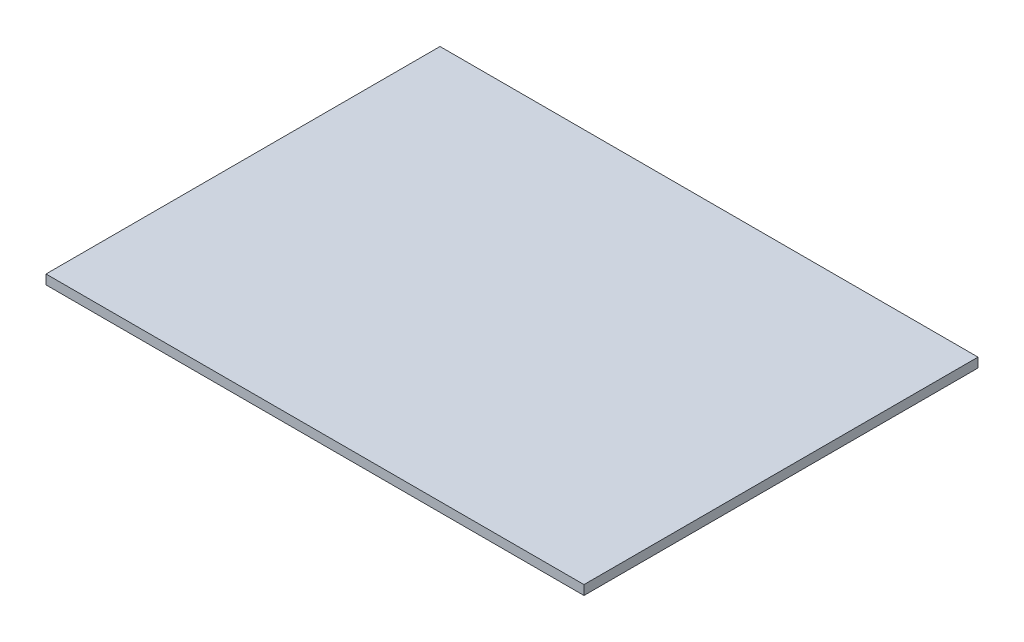
ISO-10303-21;
HEADER;
FILE_DESCRIPTION(('STEP AP214'),'2;1');
FILE_NAME('part.step','',(''),(''),'','','');
FILE_SCHEMA(('AUTOMOTIVE_DESIGN { 1 0 10303 214 1 1 1 1 }'));
ENDSEC;
DATA;
#1=APPLICATION_CONTEXT('core data for automotive mechanical design processes');
#2=APPLICATION_PROTOCOL_DEFINITION('international standard','automotive_design',2000,#1);
#3=PRODUCT_CONTEXT('',#1,'mechanical');
#4=PRODUCT('Part','Part','',(#3));
#5=PRODUCT_RELATED_PRODUCT_CATEGORY('part','',(#4));
#6=PRODUCT_DEFINITION_FORMATION('','',#4);
#7=PRODUCT_DEFINITION_CONTEXT('part definition',#1,'design');
#8=PRODUCT_DEFINITION('design','',#6,#7);
#9=PRODUCT_DEFINITION_SHAPE('','',#8);
#10=(LENGTH_UNIT() NAMED_UNIT(*) SI_UNIT(.MILLI.,.METRE.));
#11=(NAMED_UNIT(*) PLANE_ANGLE_UNIT() SI_UNIT($,.RADIAN.));
#12=(NAMED_UNIT(*) SI_UNIT($,.STERADIAN.) SOLID_ANGLE_UNIT());
#13=UNCERTAINTY_MEASURE_WITH_UNIT(LENGTH_MEASURE(1.E-05),#10,'distance_accuracy_value','');
#14=(GEOMETRIC_REPRESENTATION_CONTEXT(3) GLOBAL_UNCERTAINTY_ASSIGNED_CONTEXT((#13)) GLOBAL_UNIT_ASSIGNED_CONTEXT((#10,
#11,#12)) REPRESENTATION_CONTEXT('',''));
#15=CARTESIAN_POINT('',(0.,0.,0.));
#16=DIRECTION('',(0.,0.,1.));
#17=DIRECTION('',(1.,0.,0.));
#18=AXIS2_PLACEMENT_3D('',#15,#16,#17);
#19=CARTESIAN_POINT('',(45.085,1.5875,33.02));
#20=DIRECTION('',(-1.,0.,0.));
#21=DIRECTION('',(0.,0.,1.));
#22=AXIS2_PLACEMENT_3D('',#19,#20,#21);
#23=PLANE('',#22);
#24=DIRECTION('',(0.,0.,-1.));
#25=VECTOR('',#24,1.);
#26=CARTESIAN_POINT('',(45.085,0.,33.02));
#27=LINE('',#26,#25);
#28=CARTESIAN_POINT('',(45.085,0.,33.02));
#29=VERTEX_POINT('',#28);
#30=CARTESIAN_POINT('',(45.085,0.,-33.02));
#31=VERTEX_POINT('',#30);
#32=EDGE_CURVE('E106',#29,#31,#27,.T.);
#33=ORIENTED_EDGE('',*,*,#32,.T.);
#34=DIRECTION('',(0.,-1.,0.));
#35=VECTOR('',#34,1.);
#36=CARTESIAN_POINT('',(45.085,1.5875,-33.02));
#37=LINE('',#36,#35);
#38=CARTESIAN_POINT('',(45.085,1.5875,-33.02));
#39=VERTEX_POINT('',#38);
#40=EDGE_CURVE('E11',#39,#31,#37,.T.);
#41=ORIENTED_EDGE('',*,*,#40,.F.);
#42=DIRECTION('',(0.,0.,-1.));
#43=VECTOR('',#42,1.);
#44=CARTESIAN_POINT('',(45.085,1.5875,33.02));
#45=LINE('',#44,#43);
#46=CARTESIAN_POINT('',(45.085,1.5875,33.02));
#47=VERTEX_POINT('',#46);
#48=EDGE_CURVE('E91',#47,#39,#45,.T.);
#49=ORIENTED_EDGE('',*,*,#48,.F.);
#50=DIRECTION('',(0.,-1.,0.));
#51=VECTOR('',#50,1.);
#52=CARTESIAN_POINT('',(45.085,1.5875,33.02));
#53=LINE('',#52,#51);
#54=EDGE_CURVE('E102',#47,#29,#53,.T.);
#55=ORIENTED_EDGE('',*,*,#54,.T.);
#56=EDGE_LOOP('',(#33,#41,#49,#55));
#57=FACE_BOUND('',#56,.T.);
#58=ADVANCED_FACE('F38',(#57),#23,.F.);
#59=CARTESIAN_POINT('',(-45.085,1.5875,-33.02));
#60=DIRECTION('',(0.,0.,1.));
#61=DIRECTION('',(1.,0.,0.));
#62=AXIS2_PLACEMENT_3D('',#59,#60,#61);
#63=PLANE('',#62);
#64=DIRECTION('',(-1.,0.,0.));
#65=VECTOR('',#64,1.);
#66=CARTESIAN_POINT('',(-45.085,0.,-33.02));
#67=LINE('',#66,#65);
#68=CARTESIAN_POINT('',(-45.085,0.,-33.02));
#69=VERTEX_POINT('',#68);
#70=EDGE_CURVE('E95',#31,#69,#67,.T.);
#71=ORIENTED_EDGE('',*,*,#70,.T.);
#72=DIRECTION('',(0.,-1.,0.));
#73=VECTOR('',#72,1.);
#74=CARTESIAN_POINT('',(-45.085,1.5875,-33.02));
#75=LINE('',#74,#73);
#76=CARTESIAN_POINT('',(-45.085,1.5875,-33.02));
#77=VERTEX_POINT('',#76);
#78=EDGE_CURVE('E46',#77,#69,#75,.T.);
#79=ORIENTED_EDGE('',*,*,#78,.F.);
#80=DIRECTION('',(-1.,0.,0.));
#81=VECTOR('',#80,1.);
#82=CARTESIAN_POINT('',(-45.085,1.5875,-33.02));
#83=LINE('',#82,#81);
#84=EDGE_CURVE('E86',#39,#77,#83,.T.);
#85=ORIENTED_EDGE('',*,*,#84,.F.);
#86=ORIENTED_EDGE('',*,*,#40,.T.);
#87=EDGE_LOOP('',(#71,#79,#85,#86));
#88=FACE_BOUND('',#87,.T.);
#89=ADVANCED_FACE('F94',(#88),#63,.F.);
#90=CARTESIAN_POINT('',(-45.085,1.5875,33.02));
#91=DIRECTION('',(1.,0.,0.));
#92=DIRECTION('',(0.,0.,-1.));
#93=AXIS2_PLACEMENT_3D('',#90,#91,#92);
#94=PLANE('',#93);
#95=DIRECTION('',(0.,0.,1.));
#96=VECTOR('',#95,1.);
#97=CARTESIAN_POINT('',(-45.085,0.,33.02));
#98=LINE('',#97,#96);
#99=CARTESIAN_POINT('',(-45.085,0.,33.02));
#100=VERTEX_POINT('',#99);
#101=EDGE_CURVE('E73',#69,#100,#98,.T.);
#102=ORIENTED_EDGE('',*,*,#101,.T.);
#103=DIRECTION('',(0.,-1.,0.));
#104=VECTOR('',#103,1.);
#105=CARTESIAN_POINT('',(-45.085,1.5875,33.02));
#106=LINE('',#105,#104);
#107=CARTESIAN_POINT('',(-45.085,1.5875,33.02));
#108=VERTEX_POINT('',#107);
#109=EDGE_CURVE('E96',#108,#100,#106,.T.);
#110=ORIENTED_EDGE('',*,*,#109,.F.);
#111=DIRECTION('',(0.,0.,1.));
#112=VECTOR('',#111,1.);
#113=CARTESIAN_POINT('',(-45.085,1.5875,33.02));
#114=LINE('',#113,#112);
#115=EDGE_CURVE('E89',#77,#108,#114,.T.);
#116=ORIENTED_EDGE('',*,*,#115,.F.);
#117=ORIENTED_EDGE('',*,*,#78,.T.);
#118=EDGE_LOOP('',(#102,#110,#116,#117));
#119=FACE_BOUND('',#118,.T.);
#120=ADVANCED_FACE('F97',(#119),#94,.F.);
#121=CARTESIAN_POINT('',(-45.085,1.5875,33.02));
#122=DIRECTION('',(0.,0.,-1.));
#123=DIRECTION('',(-1.,0.,0.));
#124=AXIS2_PLACEMENT_3D('',#121,#122,#123);
#125=PLANE('',#124);
#126=DIRECTION('',(1.,0.,0.));
#127=VECTOR('',#126,1.);
#128=CARTESIAN_POINT('',(-45.085,0.,33.02));
#129=LINE('',#128,#127);
#130=EDGE_CURVE('E79',#100,#29,#129,.T.);
#131=ORIENTED_EDGE('',*,*,#130,.T.);
#132=ORIENTED_EDGE('',*,*,#54,.F.);
#133=DIRECTION('',(1.,0.,0.));
#134=VECTOR('',#133,1.);
#135=CARTESIAN_POINT('',(-45.085,1.5875,33.02));
#136=LINE('',#135,#134);
#137=EDGE_CURVE('E54',#108,#47,#136,.T.);
#138=ORIENTED_EDGE('',*,*,#137,.F.);
#139=ORIENTED_EDGE('',*,*,#109,.T.);
#140=EDGE_LOOP('',(#131,#132,#138,#139));
#141=FACE_BOUND('',#140,.T.);
#142=ADVANCED_FACE('F115',(#141),#125,.F.);
#143=CARTESIAN_POINT('',(45.085,1.5875,-33.02));
#144=DIRECTION('',(0.,-1.,0.));
#145=DIRECTION('',(0.,0.,-1.));
#146=AXIS2_PLACEMENT_3D('',#143,#144,#145);
#147=PLANE('',#146);
#148=ORIENTED_EDGE('',*,*,#48,.T.);
#149=ORIENTED_EDGE('',*,*,#84,.T.);
#150=ORIENTED_EDGE('',*,*,#115,.T.);
#151=ORIENTED_EDGE('',*,*,#137,.T.);
#152=EDGE_LOOP('',(#148,#149,#150,#151));
#153=FACE_BOUND('',#152,.T.);
#154=ADVANCED_FACE('F87',(#153),#147,.F.);
#155=CARTESIAN_POINT('',(45.085,0.,-33.02));
#156=DIRECTION('',(0.,-1.,0.));
#157=DIRECTION('',(0.,0.,-1.));
#158=AXIS2_PLACEMENT_3D('',#155,#156,#157);
#159=PLANE('',#158);
#160=ORIENTED_EDGE('',*,*,#32,.F.);
#161=ORIENTED_EDGE('',*,*,#130,.F.);
#162=ORIENTED_EDGE('',*,*,#101,.F.);
#163=ORIENTED_EDGE('',*,*,#70,.F.);
#164=EDGE_LOOP('',(#160,#161,#162,#163));
#165=FACE_BOUND('',#164,.T.);
#166=ADVANCED_FACE('F118',(#165),#159,.T.);
#167=CLOSED_SHELL('',(#58,#89,#120,#142,#154,#166));
#168=MANIFOLD_SOLID_BREP('B2',#167);
#169=ADVANCED_BREP_SHAPE_REPRESENTATION('',(#18,#168),#14);
#170=SHAPE_DEFINITION_REPRESENTATION(#9,#169);
ENDSEC;
END-ISO-10303-21;
